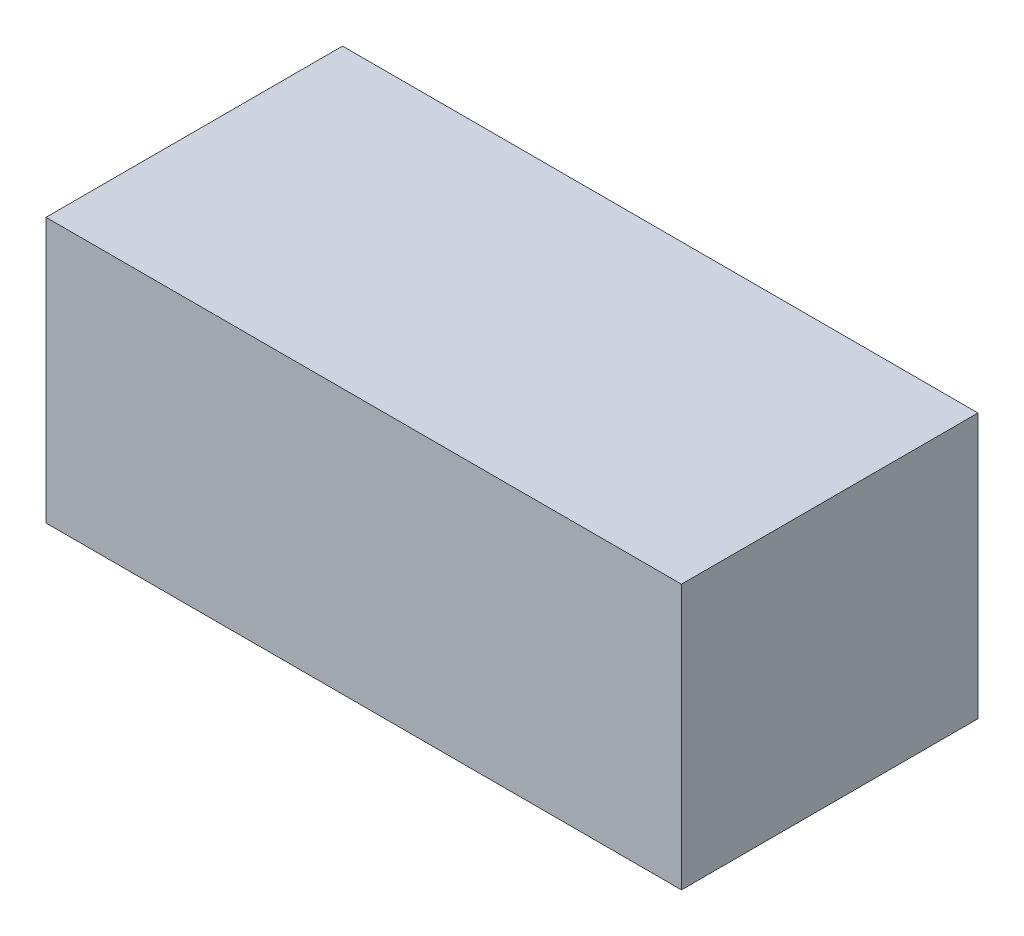
ISO-10303-21;
HEADER;
FILE_DESCRIPTION(('STEP AP214'),'2;1');
FILE_NAME('part.step','',(''),(''),'','','');
FILE_SCHEMA(('AUTOMOTIVE_DESIGN { 1 0 10303 214 1 1 1 1 }'));
ENDSEC;
DATA;
#1=APPLICATION_CONTEXT('core data for automotive mechanical design processes');
#2=APPLICATION_PROTOCOL_DEFINITION('international standard','automotive_design',2000,#1);
#3=PRODUCT_CONTEXT('',#1,'mechanical');
#4=PRODUCT('Part','Part','',(#3));
#5=PRODUCT_RELATED_PRODUCT_CATEGORY('part','',(#4));
#6=PRODUCT_DEFINITION_FORMATION('','',#4);
#7=PRODUCT_DEFINITION_CONTEXT('part definition',#1,'design');
#8=PRODUCT_DEFINITION('design','',#6,#7);
#9=PRODUCT_DEFINITION_SHAPE('','',#8);
#10=(LENGTH_UNIT() NAMED_UNIT(*) SI_UNIT(.MILLI.,.METRE.));
#11=(NAMED_UNIT(*) PLANE_ANGLE_UNIT() SI_UNIT($,.RADIAN.));
#12=(NAMED_UNIT(*) SI_UNIT($,.STERADIAN.) SOLID_ANGLE_UNIT());
#13=UNCERTAINTY_MEASURE_WITH_UNIT(LENGTH_MEASURE(1.E-05),#10,'distance_accuracy_value','');
#14=(GEOMETRIC_REPRESENTATION_CONTEXT(3) GLOBAL_UNCERTAINTY_ASSIGNED_CONTEXT((#13)) GLOBAL_UNIT_ASSIGNED_CONTEXT((#10,
#11,#12)) REPRESENTATION_CONTEXT('',''));
#15=CARTESIAN_POINT('',(0.,0.,0.));
#16=DIRECTION('',(0.,0.,1.));
#17=DIRECTION('',(1.,0.,0.));
#18=AXIS2_PLACEMENT_3D('',#15,#16,#17);
#19=CARTESIAN_POINT('',(-18.1351351351351,25.,-11.1148648648649));
#20=DIRECTION('',(0.,0.,-1.));
#21=DIRECTION('',(-1.,0.,0.));
#22=AXIS2_PLACEMENT_3D('',#19,#20,#21);
#23=PLANE('',#22);
#24=DIRECTION('',(1.,0.,0.));
#25=VECTOR('',#24,1.);
#26=CARTESIAN_POINT('',(-18.1351351351351,0.,-11.1148648648649));
#27=LINE('',#26,#25);
#28=CARTESIAN_POINT('',(-18.1351351351351,0.,-11.1148648648649));
#29=VERTEX_POINT('',#28);
#30=CARTESIAN_POINT('',(41.8648648648649,0.,-11.1148648648649));
#31=VERTEX_POINT('',#30);
#32=EDGE_CURVE('E112',#29,#31,#27,.T.);
#33=ORIENTED_EDGE('',*,*,#32,.F.);
#34=DIRECTION('',(0.,-1.,0.));
#35=VECTOR('',#34,1.);
#36=CARTESIAN_POINT('',(-18.1351351351351,25.,-11.1148648648649));
#37=LINE('',#36,#35);
#38=CARTESIAN_POINT('',(-18.1351351351351,25.,-11.1148648648649));
#39=VERTEX_POINT('',#38);
#40=EDGE_CURVE('E11',#39,#29,#37,.T.);
#41=ORIENTED_EDGE('',*,*,#40,.F.);
#42=DIRECTION('',(1.,0.,0.));
#43=VECTOR('',#42,1.);
#44=CARTESIAN_POINT('',(-13.1351351351351,25.,-11.1148648648649));
#45=LINE('',#44,#43);
#46=CARTESIAN_POINT('',(41.8648648648649,25.,-11.1148648648649));
#47=VERTEX_POINT('',#46);
#48=EDGE_CURVE('E65',#39,#47,#45,.T.);
#49=ORIENTED_EDGE('',*,*,#48,.T.);
#50=DIRECTION('',(0.,-1.,0.));
#51=VECTOR('',#50,1.);
#52=CARTESIAN_POINT('',(41.8648648648649,25.,-11.1148648648649));
#53=LINE('',#52,#51);
#54=EDGE_CURVE('E49',#47,#31,#53,.T.);
#55=ORIENTED_EDGE('',*,*,#54,.T.);
#56=EDGE_LOOP('',(#33,#41,#49,#55));
#57=FACE_BOUND('',#56,.T.);
#58=ADVANCED_FACE('F45',(#57),#23,.T.);
#59=CARTESIAN_POINT('',(-18.1351351351351,25.,-11.1148648648649));
#60=DIRECTION('',(1.,0.,0.));
#61=DIRECTION('',(0.,0.,-1.));
#62=AXIS2_PLACEMENT_3D('',#59,#60,#61);
#63=PLANE('',#62);
#64=DIRECTION('',(0.,0.,1.));
#65=VECTOR('',#64,1.);
#66=CARTESIAN_POINT('',(-18.1351351351351,0.,-11.1148648648649));
#67=LINE('',#66,#65);
#68=CARTESIAN_POINT('',(-18.1351351351351,0.,16.8851351351351));
#69=VERTEX_POINT('',#68);
#70=EDGE_CURVE('E82',#29,#69,#67,.T.);
#71=ORIENTED_EDGE('',*,*,#70,.T.);
#72=DIRECTION('',(0.,-1.,0.));
#73=VECTOR('',#72,1.);
#74=CARTESIAN_POINT('',(-18.1351351351351,25.,16.8851351351351));
#75=LINE('',#74,#73);
#76=CARTESIAN_POINT('',(-18.1351351351351,25.,16.8851351351351));
#77=VERTEX_POINT('',#76);
#78=EDGE_CURVE('E56',#77,#69,#75,.T.);
#79=ORIENTED_EDGE('',*,*,#78,.F.);
#80=DIRECTION('',(0.,0.,1.));
#81=VECTOR('',#80,1.);
#82=CARTESIAN_POINT('',(-18.1351351351351,25.,-11.1148648648649));
#83=LINE('',#82,#81);
#84=EDGE_CURVE('E96',#39,#77,#83,.T.);
#85=ORIENTED_EDGE('',*,*,#84,.F.);
#86=ORIENTED_EDGE('',*,*,#40,.T.);
#87=EDGE_LOOP('',(#71,#79,#85,#86));
#88=FACE_BOUND('',#87,.T.);
#89=ADVANCED_FACE('F132',(#88),#63,.F.);
#90=CARTESIAN_POINT('',(-18.1351351351351,25.,16.8851351351351));
#91=DIRECTION('',(0.,0.,-1.));
#92=DIRECTION('',(-1.,0.,0.));
#93=AXIS2_PLACEMENT_3D('',#90,#91,#92);
#94=PLANE('',#93);
#95=DIRECTION('',(1.,0.,0.));
#96=VECTOR('',#95,1.);
#97=CARTESIAN_POINT('',(-18.1351351351351,0.,16.8851351351351));
#98=LINE('',#97,#96);
#99=CARTESIAN_POINT('',(41.8648648648649,0.,16.8851351351351));
#100=VERTEX_POINT('',#99);
#101=EDGE_CURVE('E104',#69,#100,#98,.T.);
#102=ORIENTED_EDGE('',*,*,#101,.T.);
#103=DIRECTION('',(0.,-1.,0.));
#104=VECTOR('',#103,1.);
#105=CARTESIAN_POINT('',(41.8648648648649,25.,16.8851351351351));
#106=LINE('',#105,#104);
#107=CARTESIAN_POINT('',(41.8648648648649,25.,16.8851351351351));
#108=VERTEX_POINT('',#107);
#109=EDGE_CURVE('E101',#108,#100,#106,.T.);
#110=ORIENTED_EDGE('',*,*,#109,.F.);
#111=DIRECTION('',(1.,0.,0.));
#112=VECTOR('',#111,1.);
#113=CARTESIAN_POINT('',(36.8648648648649,25.,16.8851351351351));
#114=LINE('',#113,#112);
#115=EDGE_CURVE('E90',#77,#108,#114,.T.);
#116=ORIENTED_EDGE('',*,*,#115,.F.);
#117=ORIENTED_EDGE('',*,*,#78,.T.);
#118=EDGE_LOOP('',(#102,#110,#116,#117));
#119=FACE_BOUND('',#118,.T.);
#120=ADVANCED_FACE('F102',(#119),#94,.F.);
#121=CARTESIAN_POINT('',(41.8648648648649,25.,16.8851351351351));
#122=DIRECTION('',(-1.,0.,0.));
#123=DIRECTION('',(0.,0.,1.));
#124=AXIS2_PLACEMENT_3D('',#121,#122,#123);
#125=PLANE('',#124);
#126=DIRECTION('',(0.,0.,-1.));
#127=VECTOR('',#126,1.);
#128=CARTESIAN_POINT('',(41.8648648648649,0.,16.8851351351351));
#129=LINE('',#128,#127);
#130=EDGE_CURVE('E117',#100,#31,#129,.T.);
#131=ORIENTED_EDGE('',*,*,#130,.T.);
#132=ORIENTED_EDGE('',*,*,#54,.F.);
#133=DIRECTION('',(0.,0.,-1.));
#134=VECTOR('',#133,1.);
#135=CARTESIAN_POINT('',(41.8648648648649,25.,16.8851351351351));
#136=LINE('',#135,#134);
#137=EDGE_CURVE('E94',#108,#47,#136,.T.);
#138=ORIENTED_EDGE('',*,*,#137,.F.);
#139=ORIENTED_EDGE('',*,*,#109,.T.);
#140=EDGE_LOOP('',(#131,#132,#138,#139));
#141=FACE_BOUND('',#140,.T.);
#142=ADVANCED_FACE('F47',(#141),#125,.F.);
#143=CARTESIAN_POINT('',(0.,25.,0.));
#144=DIRECTION('',(0.,1.,0.));
#145=DIRECTION('',(0.,0.,1.));
#146=AXIS2_PLACEMENT_3D('',#143,#144,#145);
#147=PLANE('',#146);
#148=ORIENTED_EDGE('',*,*,#48,.F.);
#149=ORIENTED_EDGE('',*,*,#84,.T.);
#150=ORIENTED_EDGE('',*,*,#115,.T.);
#151=ORIENTED_EDGE('',*,*,#137,.T.);
#152=EDGE_LOOP('',(#148,#149,#150,#151));
#153=FACE_BOUND('',#152,.T.);
#154=ADVANCED_FACE('F92',(#153),#147,.T.);
#155=CARTESIAN_POINT('',(0.,0.,0.));
#156=DIRECTION('',(0.,1.,0.));
#157=DIRECTION('',(0.,0.,1.));
#158=AXIS2_PLACEMENT_3D('',#155,#156,#157);
#159=PLANE('',#158);
#160=ORIENTED_EDGE('',*,*,#32,.T.);
#161=ORIENTED_EDGE('',*,*,#130,.F.);
#162=ORIENTED_EDGE('',*,*,#101,.F.);
#163=ORIENTED_EDGE('',*,*,#70,.F.);
#164=EDGE_LOOP('',(#160,#161,#162,#163));
#165=FACE_BOUND('',#164,.T.);
#166=ADVANCED_FACE('F128',(#165),#159,.F.);
#167=CLOSED_SHELL('',(#58,#89,#120,#142,#154,#166));
#168=MANIFOLD_SOLID_BREP('B2',#167);
#169=ADVANCED_BREP_SHAPE_REPRESENTATION('',(#18,#168),#14);
#170=SHAPE_DEFINITION_REPRESENTATION(#9,#169);
ENDSEC;
END-ISO-10303-21;
